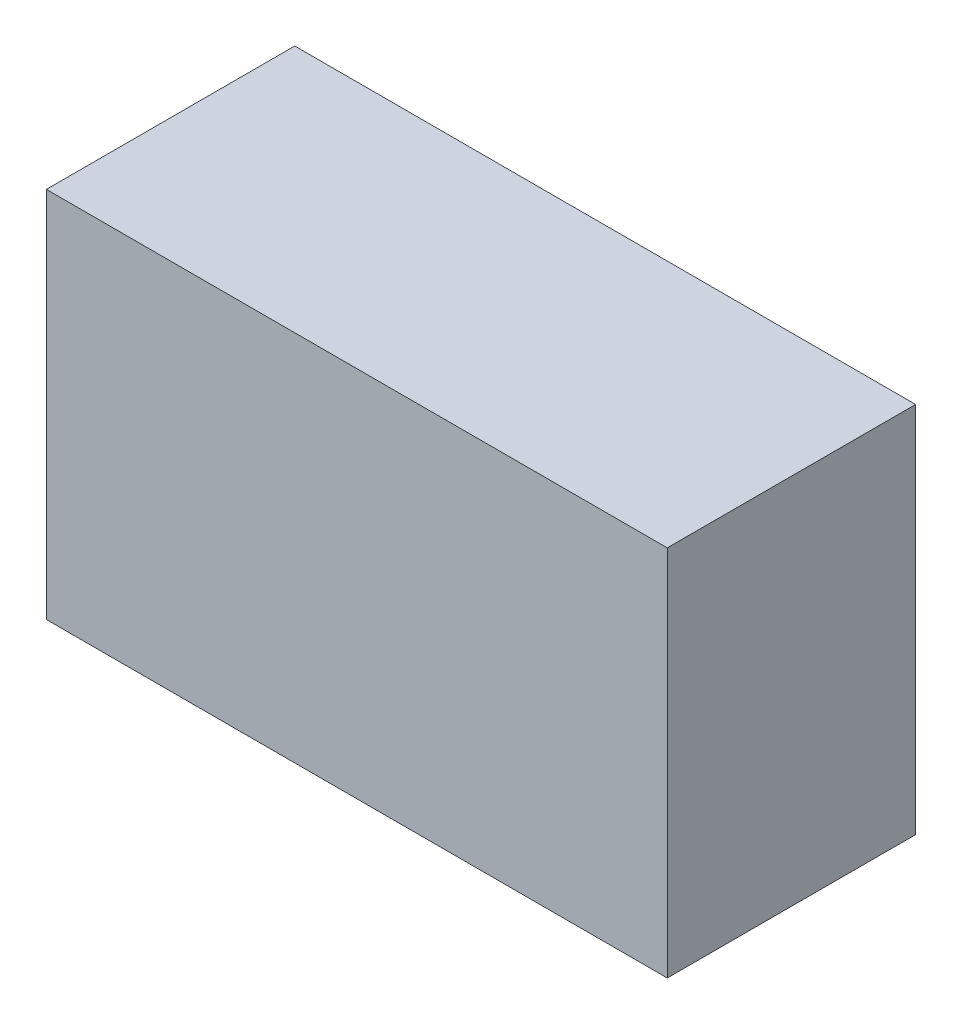
ISO-10303-21;
HEADER;
FILE_DESCRIPTION(('STEP AP214'),'2;1');
FILE_NAME('part.step','',(''),(''),'','','');
FILE_SCHEMA(('AUTOMOTIVE_DESIGN { 1 0 10303 214 1 1 1 1 }'));
ENDSEC;
DATA;
#1=APPLICATION_CONTEXT('core data for automotive mechanical design processes');
#2=APPLICATION_PROTOCOL_DEFINITION('international standard','automotive_design',2000,#1);
#3=PRODUCT_CONTEXT('',#1,'mechanical');
#4=PRODUCT('Part','Part','',(#3));
#5=PRODUCT_RELATED_PRODUCT_CATEGORY('part','',(#4));
#6=PRODUCT_DEFINITION_FORMATION('','',#4);
#7=PRODUCT_DEFINITION_CONTEXT('part definition',#1,'design');
#8=PRODUCT_DEFINITION('design','',#6,#7);
#9=PRODUCT_DEFINITION_SHAPE('','',#8);
#10=(LENGTH_UNIT() NAMED_UNIT(*) SI_UNIT(.MILLI.,.METRE.));
#11=(NAMED_UNIT(*) PLANE_ANGLE_UNIT() SI_UNIT($,.RADIAN.));
#12=(NAMED_UNIT(*) SI_UNIT($,.STERADIAN.) SOLID_ANGLE_UNIT());
#13=UNCERTAINTY_MEASURE_WITH_UNIT(LENGTH_MEASURE(1.E-05),#10,'distance_accuracy_value','');
#14=(GEOMETRIC_REPRESENTATION_CONTEXT(3) GLOBAL_UNCERTAINTY_ASSIGNED_CONTEXT((#13)) GLOBAL_UNIT_ASSIGNED_CONTEXT((#10,
#11,#12)) REPRESENTATION_CONTEXT('',''));
#15=CARTESIAN_POINT('',(0.,0.,0.));
#16=DIRECTION('',(0.,0.,1.));
#17=DIRECTION('',(1.,0.,0.));
#18=AXIS2_PLACEMENT_3D('',#15,#16,#17);
#19=CARTESIAN_POINT('',(7.0625,4.40625,5.5));
#20=DIRECTION('',(1.,0.,0.));
#21=DIRECTION('',(0.,0.,-1.));
#22=AXIS2_PLACEMENT_3D('',#19,#20,#21);
#23=PLANE('',#22);
#24=DIRECTION('',(0.,-1.,0.));
#25=VECTOR('',#24,1.);
#26=CARTESIAN_POINT('',(7.0625,4.40625,4.5));
#27=LINE('',#26,#25);
#28=CARTESIAN_POINT('',(7.0625,4.40625,4.5));
#29=VERTEX_POINT('',#28);
#30=CARTESIAN_POINT('',(7.0625,2.90625,4.5));
#31=VERTEX_POINT('',#30);
#32=EDGE_CURVE('E99',#29,#31,#27,.T.);
#33=ORIENTED_EDGE('',*,*,#32,.T.);
#34=DIRECTION('',(0.,0.,-1.));
#35=VECTOR('',#34,1.);
#36=CARTESIAN_POINT('',(7.0625,2.90625,5.5));
#37=LINE('',#36,#35);
#38=CARTESIAN_POINT('',(7.0625,2.90625,5.5));
#39=VERTEX_POINT('',#38);
#40=EDGE_CURVE('E11',#39,#31,#37,.T.);
#41=ORIENTED_EDGE('',*,*,#40,.F.);
#42=DIRECTION('',(0.,-1.,0.));
#43=VECTOR('',#42,1.);
#44=CARTESIAN_POINT('',(7.0625,4.40625,5.5));
#45=LINE('',#44,#43);
#46=CARTESIAN_POINT('',(7.0625,4.40625,5.5));
#47=VERTEX_POINT('',#46);
#48=EDGE_CURVE('E87',#47,#39,#45,.T.);
#49=ORIENTED_EDGE('',*,*,#48,.F.);
#50=DIRECTION('',(0.,0.,-1.));
#51=VECTOR('',#50,1.);
#52=CARTESIAN_POINT('',(7.0625,4.40625,5.5));
#53=LINE('',#52,#51);
#54=EDGE_CURVE('E95',#47,#29,#53,.T.);
#55=ORIENTED_EDGE('',*,*,#54,.T.);
#56=EDGE_LOOP('',(#33,#41,#49,#55));
#57=FACE_BOUND('',#56,.T.);
#58=ADVANCED_FACE('F36',(#57),#23,.F.);
#59=CARTESIAN_POINT('',(7.0625,2.90625,5.5));
#60=DIRECTION('',(0.,1.,0.));
#61=DIRECTION('',(0.,0.,1.));
#62=AXIS2_PLACEMENT_3D('',#59,#60,#61);
#63=PLANE('',#62);
#64=DIRECTION('',(1.,0.,0.));
#65=VECTOR('',#64,1.);
#66=CARTESIAN_POINT('',(7.0625,2.90625,4.5));
#67=LINE('',#66,#65);
#68=CARTESIAN_POINT('',(9.5625,2.90625,4.5));
#69=VERTEX_POINT('',#68);
#70=EDGE_CURVE('E91',#31,#69,#67,.T.);
#71=ORIENTED_EDGE('',*,*,#70,.T.);
#72=DIRECTION('',(0.,0.,-1.));
#73=VECTOR('',#72,1.);
#74=CARTESIAN_POINT('',(9.5625,2.90625,5.5));
#75=LINE('',#74,#73);
#76=CARTESIAN_POINT('',(9.5625,2.90625,5.5));
#77=VERTEX_POINT('',#76);
#78=EDGE_CURVE('E44',#77,#69,#75,.T.);
#79=ORIENTED_EDGE('',*,*,#78,.F.);
#80=DIRECTION('',(1.,0.,0.));
#81=VECTOR('',#80,1.);
#82=CARTESIAN_POINT('',(7.0625,2.90625,5.5));
#83=LINE('',#82,#81);
#84=EDGE_CURVE('E82',#39,#77,#83,.T.);
#85=ORIENTED_EDGE('',*,*,#84,.F.);
#86=ORIENTED_EDGE('',*,*,#40,.T.);
#87=EDGE_LOOP('',(#71,#79,#85,#86));
#88=FACE_BOUND('',#87,.T.);
#89=ADVANCED_FACE('F90',(#88),#63,.F.);
#90=CARTESIAN_POINT('',(9.5625,4.40625,5.5));
#91=DIRECTION('',(-1.,0.,0.));
#92=DIRECTION('',(0.,0.,1.));
#93=AXIS2_PLACEMENT_3D('',#90,#91,#92);
#94=PLANE('',#93);
#95=DIRECTION('',(0.,1.,0.));
#96=VECTOR('',#95,1.);
#97=CARTESIAN_POINT('',(9.5625,4.40625,4.5));
#98=LINE('',#97,#96);
#99=CARTESIAN_POINT('',(9.5625,4.40625,4.5));
#100=VERTEX_POINT('',#99);
#101=EDGE_CURVE('E69',#69,#100,#98,.T.);
#102=ORIENTED_EDGE('',*,*,#101,.T.);
#103=DIRECTION('',(0.,0.,-1.));
#104=VECTOR('',#103,1.);
#105=CARTESIAN_POINT('',(9.5625,4.40625,5.5));
#106=LINE('',#105,#104);
#107=CARTESIAN_POINT('',(9.5625,4.40625,5.5));
#108=VERTEX_POINT('',#107);
#109=EDGE_CURVE('E92',#108,#100,#106,.T.);
#110=ORIENTED_EDGE('',*,*,#109,.F.);
#111=DIRECTION('',(0.,1.,0.));
#112=VECTOR('',#111,1.);
#113=CARTESIAN_POINT('',(9.5625,4.40625,5.5));
#114=LINE('',#113,#112);
#115=EDGE_CURVE('E85',#77,#108,#114,.T.);
#116=ORIENTED_EDGE('',*,*,#115,.F.);
#117=ORIENTED_EDGE('',*,*,#78,.T.);
#118=EDGE_LOOP('',(#102,#110,#116,#117));
#119=FACE_BOUND('',#118,.T.);
#120=ADVANCED_FACE('F93',(#119),#94,.F.);
#121=CARTESIAN_POINT('',(7.0625,4.40625,5.5));
#122=DIRECTION('',(0.,-1.,0.));
#123=DIRECTION('',(0.,0.,-1.));
#124=AXIS2_PLACEMENT_3D('',#121,#122,#123);
#125=PLANE('',#124);
#126=DIRECTION('',(-1.,0.,0.));
#127=VECTOR('',#126,1.);
#128=CARTESIAN_POINT('',(7.0625,4.40625,4.5));
#129=LINE('',#128,#127);
#130=EDGE_CURVE('E75',#100,#29,#129,.T.);
#131=ORIENTED_EDGE('',*,*,#130,.T.);
#132=ORIENTED_EDGE('',*,*,#54,.F.);
#133=DIRECTION('',(-1.,0.,0.));
#134=VECTOR('',#133,1.);
#135=CARTESIAN_POINT('',(7.0625,4.40625,5.5));
#136=LINE('',#135,#134);
#137=EDGE_CURVE('E52',#108,#47,#136,.T.);
#138=ORIENTED_EDGE('',*,*,#137,.F.);
#139=ORIENTED_EDGE('',*,*,#109,.T.);
#140=EDGE_LOOP('',(#131,#132,#138,#139));
#141=FACE_BOUND('',#140,.T.);
#142=ADVANCED_FACE('F106',(#141),#125,.F.);
#143=CARTESIAN_POINT('',(7.48125,3.290625,5.5));
#144=DIRECTION('',(0.,0.,1.));
#145=DIRECTION('',(1.,0.,0.));
#146=AXIS2_PLACEMENT_3D('',#143,#144,#145);
#147=PLANE('',#146);
#148=ORIENTED_EDGE('',*,*,#48,.T.);
#149=ORIENTED_EDGE('',*,*,#84,.T.);
#150=ORIENTED_EDGE('',*,*,#115,.T.);
#151=ORIENTED_EDGE('',*,*,#137,.T.);
#152=EDGE_LOOP('',(#148,#149,#150,#151));
#153=FACE_BOUND('',#152,.T.);
#154=ADVANCED_FACE('F83',(#153),#147,.T.);
#155=CARTESIAN_POINT('',(7.48125,3.290625,4.5));
#156=DIRECTION('',(0.,0.,1.));
#157=DIRECTION('',(1.,0.,0.));
#158=AXIS2_PLACEMENT_3D('',#155,#156,#157);
#159=PLANE('',#158);
#160=ORIENTED_EDGE('',*,*,#32,.F.);
#161=ORIENTED_EDGE('',*,*,#130,.F.);
#162=ORIENTED_EDGE('',*,*,#101,.F.);
#163=ORIENTED_EDGE('',*,*,#70,.F.);
#164=EDGE_LOOP('',(#160,#161,#162,#163));
#165=FACE_BOUND('',#164,.T.);
#166=ADVANCED_FACE('F109',(#165),#159,.F.);
#167=CLOSED_SHELL('',(#58,#89,#120,#142,#154,#166));
#168=MANIFOLD_SOLID_BREP('B2',#167);
#169=ADVANCED_BREP_SHAPE_REPRESENTATION('',(#18,#168),#14);
#170=SHAPE_DEFINITION_REPRESENTATION(#9,#169);
ENDSEC;
END-ISO-10303-21;
